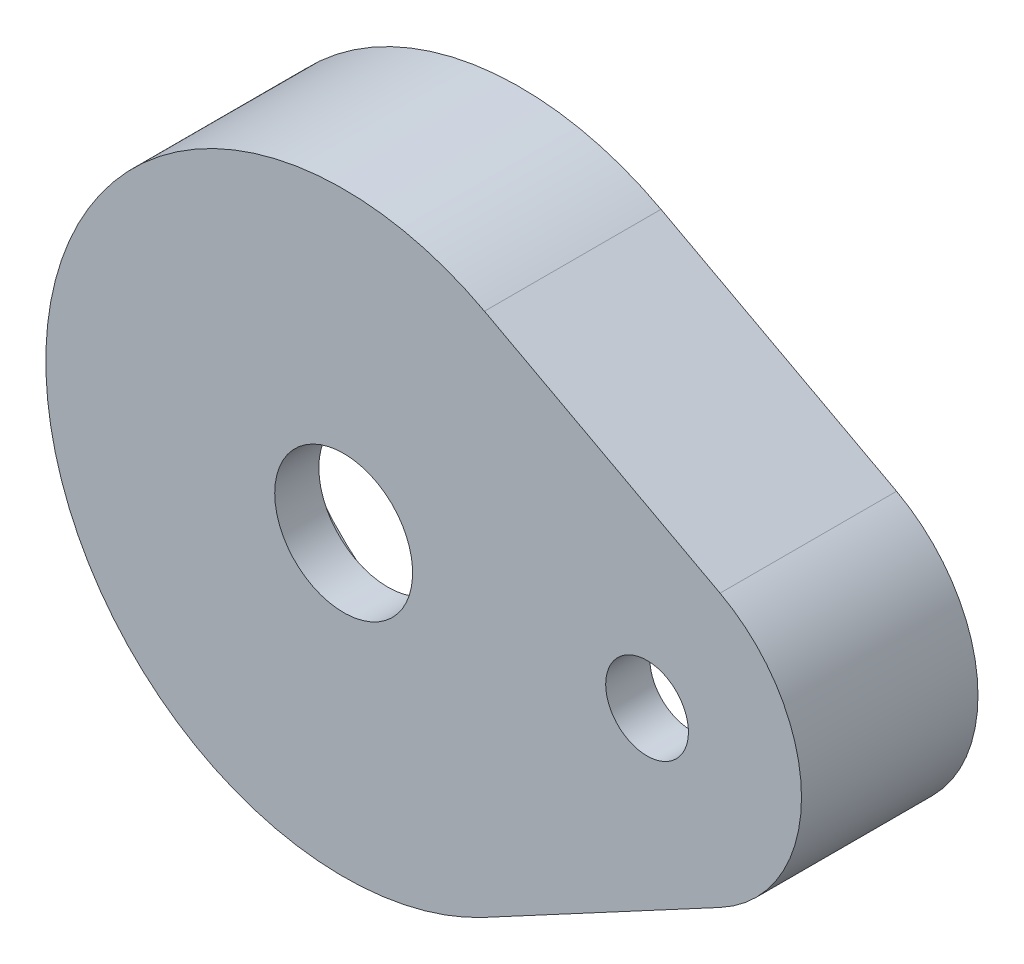
ISO-10303-21;
HEADER;
FILE_DESCRIPTION(('STEP AP214'),'2;1');
FILE_NAME('part.step','',(''),(''),'','','');
FILE_SCHEMA(('AUTOMOTIVE_DESIGN { 1 0 10303 214 1 1 1 1 }'));
ENDSEC;
DATA;
#1=APPLICATION_CONTEXT('core data for automotive mechanical design processes');
#2=APPLICATION_PROTOCOL_DEFINITION('international standard','automotive_design',2000,#1);
#3=PRODUCT_CONTEXT('',#1,'mechanical');
#4=PRODUCT('Part','Part','',(#3));
#5=PRODUCT_RELATED_PRODUCT_CATEGORY('part','',(#4));
#6=PRODUCT_DEFINITION_FORMATION('','',#4);
#7=PRODUCT_DEFINITION_CONTEXT('part definition',#1,'design');
#8=PRODUCT_DEFINITION('design','',#6,#7);
#9=PRODUCT_DEFINITION_SHAPE('','',#8);
#10=(LENGTH_UNIT() NAMED_UNIT(*) SI_UNIT(.MILLI.,.METRE.));
#11=(NAMED_UNIT(*) PLANE_ANGLE_UNIT() SI_UNIT($,.RADIAN.));
#12=(NAMED_UNIT(*) SI_UNIT($,.STERADIAN.) SOLID_ANGLE_UNIT());
#13=UNCERTAINTY_MEASURE_WITH_UNIT(LENGTH_MEASURE(1.E-05),#10,'distance_accuracy_value','');
#14=(GEOMETRIC_REPRESENTATION_CONTEXT(3) GLOBAL_UNCERTAINTY_ASSIGNED_CONTEXT((#13)) GLOBAL_UNIT_ASSIGNED_CONTEXT((#10,
#11,#12)) REPRESENTATION_CONTEXT('',''));
#15=CARTESIAN_POINT('',(0.,0.,0.));
#16=DIRECTION('',(0.,0.,1.));
#17=DIRECTION('',(1.,0.,0.));
#18=AXIS2_PLACEMENT_3D('',#15,#16,#17);
#19=CARTESIAN_POINT('',(0.,0.,0.));
#20=DIRECTION('',(0.,0.,1.));
#21=DIRECTION('',(1.,0.,0.));
#22=AXIS2_PLACEMENT_3D('',#19,#20,#21);
#23=PLANE('',#22);
#24=CARTESIAN_POINT('',(0.,0.,0.));
#25=DIRECTION('',(0.,0.,1.));
#26=DIRECTION('',(1.,0.,0.));
#27=AXIS2_PLACEMENT_3D('',#24,#25,#26);
#28=CIRCLE('',#27,17.145);
#29=CARTESIAN_POINT('',(8.1049090909091,15.1083246466343,0.));
#30=VERTEX_POINT('',#29);
#31=CARTESIAN_POINT('',(8.10490909090909,-15.1083246466344,0.));
#32=VERTEX_POINT('',#31);
#33=EDGE_CURVE('E133',#30,#32,#28,.T.);
#34=ORIENTED_EDGE('',*,*,#33,.F.);
#35=DIRECTION('',(-0.88120878662201,0.472727272727273,0.));
#36=VECTOR('',#35,1.);
#37=CARTESIAN_POINT('',(8.1049090909091,15.1083246466343,0.));
#38=LINE('',#37,#36);
#39=CARTESIAN_POINT('',(21.6650454545455,7.83394611306966,0.));
#40=VERTEX_POINT('',#39);
#41=EDGE_CURVE('E88',#40,#30,#38,.T.);
#42=ORIENTED_EDGE('',*,*,#41,.F.);
#43=CARTESIAN_POINT('',(17.4625,0.,0.));
#44=DIRECTION('',(0.,0.,1.));
#45=DIRECTION('',(1.,0.,0.));
#46=AXIS2_PLACEMENT_3D('',#43,#44,#45);
#47=CIRCLE('',#46,8.89);
#48=CARTESIAN_POINT('',(21.6650454545454,-7.83394611306966,0.));
#49=VERTEX_POINT('',#48);
#50=EDGE_CURVE('E153',#49,#40,#47,.T.);
#51=ORIENTED_EDGE('',*,*,#50,.F.);
#52=DIRECTION('',(0.88120878662201,0.472727272727273,0.));
#53=VECTOR('',#52,1.);
#54=CARTESIAN_POINT('',(8.10490909090909,-15.1083246466344,0.));
#55=LINE('',#54,#53);
#56=EDGE_CURVE('E138',#32,#49,#55,.T.);
#57=ORIENTED_EDGE('',*,*,#56,.F.);
#58=EDGE_LOOP('',(#34,#42,#51,#57));
#59=FACE_BOUND('',#58,.T.);
#60=CARTESIAN_POINT('',(0.,0.,0.));
#61=DIRECTION('',(0.,0.,1.));
#62=DIRECTION('',(1.,0.,0.));
#63=AXIS2_PLACEMENT_3D('',#60,#61,#62);
#64=CIRCLE('',#63,14.605);
#65=CARTESIAN_POINT('',(6.90418181818182,12.8700543286145,0.));
#66=VERTEX_POINT('',#65);
#67=CARTESIAN_POINT('',(6.90418181818182,-12.8700543286145,0.));
#68=VERTEX_POINT('',#67);
#69=EDGE_CURVE('E57',#66,#68,#64,.T.);
#70=ORIENTED_EDGE('',*,*,#69,.T.);
#71=DIRECTION('',(0.88120878662201,0.472727272727273,0.));
#72=VECTOR('',#71,1.);
#73=CARTESIAN_POINT('',(6.90418181818182,-12.8700543286145,0.));
#74=LINE('',#73,#72);
#75=CARTESIAN_POINT('',(20.4643181818182,-5.59567579504976,0.));
#76=VERTEX_POINT('',#75);
#77=EDGE_CURVE('E131',#68,#76,#74,.T.);
#78=ORIENTED_EDGE('',*,*,#77,.T.);
#79=CARTESIAN_POINT('',(17.4625,0.,0.));
#80=DIRECTION('',(0.,0.,1.));
#81=DIRECTION('',(1.,0.,0.));
#82=AXIS2_PLACEMENT_3D('',#79,#80,#81);
#83=CIRCLE('',#82,6.35);
#84=CARTESIAN_POINT('',(20.4643181818182,5.59567579504977,0.));
#85=VERTEX_POINT('',#84);
#86=EDGE_CURVE('E178',#76,#85,#83,.T.);
#87=ORIENTED_EDGE('',*,*,#86,.T.);
#88=DIRECTION('',(-0.88120878662201,0.472727272727273,0.));
#89=VECTOR('',#88,1.);
#90=CARTESIAN_POINT('',(6.90418181818182,12.8700543286145,0.));
#91=LINE('',#90,#89);
#92=EDGE_CURVE('E128',#85,#66,#91,.T.);
#93=ORIENTED_EDGE('',*,*,#92,.T.);
#94=EDGE_LOOP('',(#70,#78,#87,#93));
#95=FACE_BOUND('',#94,.T.);
#96=ADVANCED_FACE('F39',(#59,#95),#23,.F.);
#97=CARTESIAN_POINT('',(0.,0.,10.16));
#98=DIRECTION('',(0.,0.,-1.));
#99=DIRECTION('',(-1.,0.,0.));
#100=AXIS2_PLACEMENT_3D('',#97,#98,#99);
#101=CYLINDRICAL_SURFACE('',#100,17.145);
#102=ORIENTED_EDGE('',*,*,#33,.T.);
#103=DIRECTION('',(0.,0.,-1.));
#104=VECTOR('',#103,1.);
#105=CARTESIAN_POINT('',(8.10490909090909,-15.1083246466344,10.16));
#106=LINE('',#105,#104);
#107=CARTESIAN_POINT('',(8.10490909090909,-15.1083246466344,10.16));
#108=VERTEX_POINT('',#107);
#109=EDGE_CURVE('E11',#108,#32,#106,.T.);
#110=ORIENTED_EDGE('',*,*,#109,.F.);
#111=CARTESIAN_POINT('',(0.,0.,10.16));
#112=DIRECTION('',(0.,0.,1.));
#113=DIRECTION('',(1.,0.,0.));
#114=AXIS2_PLACEMENT_3D('',#111,#112,#113);
#115=CIRCLE('',#114,17.145);
#116=CARTESIAN_POINT('',(8.1049090909091,15.1083246466343,10.16));
#117=VERTEX_POINT('',#116);
#118=EDGE_CURVE('E144',#117,#108,#115,.T.);
#119=ORIENTED_EDGE('',*,*,#118,.F.);
#120=DIRECTION('',(0.,0.,-1.));
#121=VECTOR('',#120,1.);
#122=CARTESIAN_POINT('',(8.1049090909091,15.1083246466343,10.16));
#123=LINE('',#122,#121);
#124=EDGE_CURVE('E147',#117,#30,#123,.T.);
#125=ORIENTED_EDGE('',*,*,#124,.T.);
#126=EDGE_LOOP('',(#102,#110,#119,#125));
#127=FACE_BOUND('',#126,.T.);
#128=ADVANCED_FACE('F41',(#127),#101,.T.);
#129=CARTESIAN_POINT('',(8.10490909090909,-15.1083246466344,10.16));
#130=DIRECTION('',(-0.472727272727273,0.88120878662201,0.));
#131=DIRECTION('',(-0.88120878662201,-0.472727272727273,0.));
#132=AXIS2_PLACEMENT_3D('',#129,#130,#131);
#133=PLANE('',#132);
#134=ORIENTED_EDGE('',*,*,#56,.T.);
#135=DIRECTION('',(0.,0.,-1.));
#136=VECTOR('',#135,1.);
#137=CARTESIAN_POINT('',(21.6650454545454,-7.83394611306966,10.16));
#138=LINE('',#137,#136);
#139=CARTESIAN_POINT('',(21.6650454545454,-7.83394611306966,10.16));
#140=VERTEX_POINT('',#139);
#141=EDGE_CURVE('E48',#140,#49,#138,.T.);
#142=ORIENTED_EDGE('',*,*,#141,.F.);
#143=DIRECTION('',(0.88120878662201,0.472727272727273,0.));
#144=VECTOR('',#143,1.);
#145=CARTESIAN_POINT('',(8.10490909090909,-15.1083246466344,10.16));
#146=LINE('',#145,#144);
#147=EDGE_CURVE('E91',#108,#140,#146,.T.);
#148=ORIENTED_EDGE('',*,*,#147,.F.);
#149=ORIENTED_EDGE('',*,*,#109,.T.);
#150=EDGE_LOOP('',(#134,#142,#148,#149));
#151=FACE_BOUND('',#150,.T.);
#152=ADVANCED_FACE('F199',(#151),#133,.F.);
#153=CARTESIAN_POINT('',(17.4625,0.,10.16));
#154=DIRECTION('',(0.,0.,-1.));
#155=DIRECTION('',(-1.,0.,0.));
#156=AXIS2_PLACEMENT_3D('',#153,#154,#155);
#157=CYLINDRICAL_SURFACE('',#156,8.89);
#158=ORIENTED_EDGE('',*,*,#50,.T.);
#159=DIRECTION('',(0.,0.,-1.));
#160=VECTOR('',#159,1.);
#161=CARTESIAN_POINT('',(21.6650454545455,7.83394611306966,10.16));
#162=LINE('',#161,#160);
#163=CARTESIAN_POINT('',(21.6650454545455,7.83394611306966,10.16));
#164=VERTEX_POINT('',#163);
#165=EDGE_CURVE('E160',#164,#40,#162,.T.);
#166=ORIENTED_EDGE('',*,*,#165,.F.);
#167=CARTESIAN_POINT('',(17.4625,0.,10.16));
#168=DIRECTION('',(0.,0.,1.));
#169=DIRECTION('',(1.,0.,0.));
#170=AXIS2_PLACEMENT_3D('',#167,#168,#169);
#171=CIRCLE('',#170,8.89);
#172=EDGE_CURVE('E146',#140,#164,#171,.T.);
#173=ORIENTED_EDGE('',*,*,#172,.F.);
#174=ORIENTED_EDGE('',*,*,#141,.T.);
#175=EDGE_LOOP('',(#158,#166,#173,#174));
#176=FACE_BOUND('',#175,.T.);
#177=ADVANCED_FACE('F207',(#176),#157,.T.);
#178=CARTESIAN_POINT('',(8.1049090909091,15.1083246466343,10.16));
#179=DIRECTION('',(-0.472727272727273,-0.88120878662201,0.));
#180=DIRECTION('',(0.88120878662201,-0.472727272727273,0.));
#181=AXIS2_PLACEMENT_3D('',#178,#179,#180);
#182=PLANE('',#181);
#183=ORIENTED_EDGE('',*,*,#41,.T.);
#184=ORIENTED_EDGE('',*,*,#124,.F.);
#185=DIRECTION('',(-0.88120878662201,0.472727272727273,0.));
#186=VECTOR('',#185,1.);
#187=CARTESIAN_POINT('',(8.1049090909091,15.1083246466343,10.16));
#188=LINE('',#187,#186);
#189=EDGE_CURVE('E63',#164,#117,#188,.T.);
#190=ORIENTED_EDGE('',*,*,#189,.F.);
#191=ORIENTED_EDGE('',*,*,#165,.T.);
#192=EDGE_LOOP('',(#183,#184,#190,#191));
#193=FACE_BOUND('',#192,.T.);
#194=ADVANCED_FACE('F210',(#193),#182,.F.);
#195=CARTESIAN_POINT('',(0.,0.,10.16));
#196=DIRECTION('',(0.,0.,1.));
#197=DIRECTION('',(1.,0.,0.));
#198=AXIS2_PLACEMENT_3D('',#195,#196,#197);
#199=PLANE('',#198);
#200=CARTESIAN_POINT('',(0.,0.,10.16));
#201=DIRECTION('',(0.,0.,-1.));
#202=DIRECTION('',(-1.,0.,0.));
#203=AXIS2_PLACEMENT_3D('',#200,#201,#202);
#204=CIRCLE('',#203,3.96875);
#205=CARTESIAN_POINT('',(-3.96875,0.,10.16));
#206=VERTEX_POINT('',#205);
#207=EDGE_CURVE('E165',#206,#206,#204,.T.);
#208=ORIENTED_EDGE('',*,*,#207,.T.);
#209=EDGE_LOOP('',(#208));
#210=FACE_BOUND('',#209,.T.);
#211=CARTESIAN_POINT('',(17.4625,0.,10.16));
#212=DIRECTION('',(0.,0.,-1.));
#213=DIRECTION('',(-1.,0.,0.));
#214=AXIS2_PLACEMENT_3D('',#211,#212,#213);
#215=CIRCLE('',#214,2.38125);
#216=CARTESIAN_POINT('',(15.08125,0.,10.16));
#217=VERTEX_POINT('',#216);
#218=EDGE_CURVE('E170',#217,#217,#215,.T.);
#219=ORIENTED_EDGE('',*,*,#218,.T.);
#220=EDGE_LOOP('',(#219));
#221=FACE_BOUND('',#220,.T.);
#222=ORIENTED_EDGE('',*,*,#118,.T.);
#223=ORIENTED_EDGE('',*,*,#147,.T.);
#224=ORIENTED_EDGE('',*,*,#172,.T.);
#225=ORIENTED_EDGE('',*,*,#189,.T.);
#226=EDGE_LOOP('',(#222,#223,#224,#225));
#227=FACE_BOUND('',#226,.T.);
#228=ADVANCED_FACE('F202',(#210,#221,#227),#199,.T.);
#229=CARTESIAN_POINT('',(0.,0.,7.62));
#230=DIRECTION('',(0.,0.,-1.));
#231=DIRECTION('',(-1.,0.,0.));
#232=AXIS2_PLACEMENT_3D('',#229,#230,#231);
#233=CYLINDRICAL_SURFACE('',#232,14.605);
#234=ORIENTED_EDGE('',*,*,#69,.F.);
#235=DIRECTION('',(0.,0.,-1.));
#236=VECTOR('',#235,1.);
#237=CARTESIAN_POINT('',(6.90418181818182,12.8700543286145,7.62));
#238=LINE('',#237,#236);
#239=CARTESIAN_POINT('',(6.90418181818182,12.8700543286145,7.62));
#240=VERTEX_POINT('',#239);
#241=EDGE_CURVE('E129',#240,#66,#238,.T.);
#242=ORIENTED_EDGE('',*,*,#241,.F.);
#243=CARTESIAN_POINT('',(0.,0.,7.62));
#244=DIRECTION('',(0.,0.,1.));
#245=DIRECTION('',(1.,0.,0.));
#246=AXIS2_PLACEMENT_3D('',#243,#244,#245);
#247=CIRCLE('',#246,14.605);
#248=CARTESIAN_POINT('',(6.90418181818182,-12.8700543286145,7.62));
#249=VERTEX_POINT('',#248);
#250=EDGE_CURVE('E124',#240,#249,#247,.T.);
#251=ORIENTED_EDGE('',*,*,#250,.T.);
#252=DIRECTION('',(0.,0.,-1.));
#253=VECTOR('',#252,1.);
#254=CARTESIAN_POINT('',(6.90418181818182,-12.8700543286145,7.62));
#255=LINE('',#254,#253);
#256=EDGE_CURVE('E126',#249,#68,#255,.T.);
#257=ORIENTED_EDGE('',*,*,#256,.T.);
#258=EDGE_LOOP('',(#234,#242,#251,#257));
#259=FACE_BOUND('',#258,.T.);
#260=ADVANCED_FACE('F130',(#259),#233,.F.);
#261=CARTESIAN_POINT('',(6.90418181818182,-12.8700543286145,7.62));
#262=DIRECTION('',(-0.472727272727273,0.88120878662201,0.));
#263=DIRECTION('',(-0.88120878662201,-0.472727272727273,0.));
#264=AXIS2_PLACEMENT_3D('',#261,#262,#263);
#265=PLANE('',#264);
#266=ORIENTED_EDGE('',*,*,#77,.F.);
#267=ORIENTED_EDGE('',*,*,#256,.F.);
#268=DIRECTION('',(0.88120878662201,0.472727272727273,0.));
#269=VECTOR('',#268,1.);
#270=CARTESIAN_POINT('',(6.90418181818182,-12.8700543286145,7.62));
#271=LINE('',#270,#269);
#272=CARTESIAN_POINT('',(20.4643181818182,-5.59567579504976,7.62));
#273=VERTEX_POINT('',#272);
#274=EDGE_CURVE('E120',#249,#273,#271,.T.);
#275=ORIENTED_EDGE('',*,*,#274,.T.);
#276=DIRECTION('',(0.,0.,-1.));
#277=VECTOR('',#276,1.);
#278=CARTESIAN_POINT('',(20.4643181818182,-5.59567579504976,7.62));
#279=LINE('',#278,#277);
#280=EDGE_CURVE('E139',#273,#76,#279,.T.);
#281=ORIENTED_EDGE('',*,*,#280,.T.);
#282=EDGE_LOOP('',(#266,#267,#275,#281));
#283=FACE_BOUND('',#282,.T.);
#284=ADVANCED_FACE('F135',(#283),#265,.T.);
#285=CARTESIAN_POINT('',(17.4625,0.,7.62));
#286=DIRECTION('',(0.,0.,-1.));
#287=DIRECTION('',(-1.,0.,0.));
#288=AXIS2_PLACEMENT_3D('',#285,#286,#287);
#289=CYLINDRICAL_SURFACE('',#288,6.35);
#290=ORIENTED_EDGE('',*,*,#86,.F.);
#291=ORIENTED_EDGE('',*,*,#280,.F.);
#292=CARTESIAN_POINT('',(17.4625,0.,7.62));
#293=DIRECTION('',(0.,0.,1.));
#294=DIRECTION('',(1.,0.,0.));
#295=AXIS2_PLACEMENT_3D('',#292,#293,#294);
#296=CIRCLE('',#295,6.35);
#297=CARTESIAN_POINT('',(20.4643181818182,5.59567579504977,7.62));
#298=VERTEX_POINT('',#297);
#299=EDGE_CURVE('E121',#273,#298,#296,.T.);
#300=ORIENTED_EDGE('',*,*,#299,.T.);
#301=DIRECTION('',(0.,0.,-1.));
#302=VECTOR('',#301,1.);
#303=CARTESIAN_POINT('',(20.4643181818182,5.59567579504977,7.62));
#304=LINE('',#303,#302);
#305=EDGE_CURVE('E143',#298,#85,#304,.T.);
#306=ORIENTED_EDGE('',*,*,#305,.T.);
#307=EDGE_LOOP('',(#290,#291,#300,#306));
#308=FACE_BOUND('',#307,.T.);
#309=ADVANCED_FACE('F189',(#308),#289,.F.);
#310=CARTESIAN_POINT('',(6.90418181818182,12.8700543286145,7.62));
#311=DIRECTION('',(-0.472727272727273,-0.88120878662201,0.));
#312=DIRECTION('',(0.88120878662201,-0.472727272727273,0.));
#313=AXIS2_PLACEMENT_3D('',#310,#311,#312);
#314=PLANE('',#313);
#315=ORIENTED_EDGE('',*,*,#92,.F.);
#316=ORIENTED_EDGE('',*,*,#305,.F.);
#317=DIRECTION('',(-0.88120878662201,0.472727272727273,0.));
#318=VECTOR('',#317,1.);
#319=CARTESIAN_POINT('',(6.90418181818182,12.8700543286145,7.62));
#320=LINE('',#319,#318);
#321=EDGE_CURVE('E173',#298,#240,#320,.T.);
#322=ORIENTED_EDGE('',*,*,#321,.T.);
#323=ORIENTED_EDGE('',*,*,#241,.T.);
#324=EDGE_LOOP('',(#315,#316,#322,#323));
#325=FACE_BOUND('',#324,.T.);
#326=ADVANCED_FACE('F188',(#325),#314,.T.);
#327=CARTESIAN_POINT('',(0.,0.,7.62));
#328=DIRECTION('',(0.,0.,1.));
#329=DIRECTION('',(1.,0.,0.));
#330=AXIS2_PLACEMENT_3D('',#327,#328,#329);
#331=PLANE('',#330);
#332=CARTESIAN_POINT('',(0.,0.,7.62));
#333=DIRECTION('',(0.,0.,1.));
#334=DIRECTION('',(1.,0.,0.));
#335=AXIS2_PLACEMENT_3D('',#332,#333,#334);
#336=CIRCLE('',#335,3.96875);
#337=CARTESIAN_POINT('',(3.96875,0.,7.62));
#338=VERTEX_POINT('',#337);
#339=EDGE_CURVE('E43',#338,#338,#336,.T.);
#340=ORIENTED_EDGE('',*,*,#339,.T.);
#341=EDGE_LOOP('',(#340));
#342=FACE_BOUND('',#341,.T.);
#343=CARTESIAN_POINT('',(17.4625,0.,7.62));
#344=DIRECTION('',(0.,0.,1.));
#345=DIRECTION('',(1.,0.,0.));
#346=AXIS2_PLACEMENT_3D('',#343,#344,#345);
#347=CIRCLE('',#346,2.38125);
#348=CARTESIAN_POINT('',(19.84375,0.,7.62));
#349=VERTEX_POINT('',#348);
#350=EDGE_CURVE('E159',#349,#349,#347,.T.);
#351=ORIENTED_EDGE('',*,*,#350,.T.);
#352=EDGE_LOOP('',(#351));
#353=FACE_BOUND('',#352,.T.);
#354=ORIENTED_EDGE('',*,*,#250,.F.);
#355=ORIENTED_EDGE('',*,*,#321,.F.);
#356=ORIENTED_EDGE('',*,*,#299,.F.);
#357=ORIENTED_EDGE('',*,*,#274,.F.);
#358=EDGE_LOOP('',(#354,#355,#356,#357));
#359=FACE_BOUND('',#358,.T.);
#360=ADVANCED_FACE('F116',(#342,#353,#359),#331,.F.);
#361=CARTESIAN_POINT('',(17.4625,0.,10.16));
#362=DIRECTION('',(0.,0.,-1.));
#363=DIRECTION('',(-1.,0.,0.));
#364=AXIS2_PLACEMENT_3D('',#361,#362,#363);
#365=CYLINDRICAL_SURFACE('',#364,2.38125);
#366=ORIENTED_EDGE('',*,*,#218,.F.);
#367=EDGE_LOOP('',(#366));
#368=FACE_BOUND('',#367,.T.);
#369=ORIENTED_EDGE('',*,*,#350,.F.);
#370=EDGE_LOOP('',(#369));
#371=FACE_BOUND('',#370,.T.);
#372=ADVANCED_FACE('F229',(#368,#371),#365,.F.);
#373=CARTESIAN_POINT('',(0.,0.,10.16));
#374=DIRECTION('',(0.,0.,-1.));
#375=DIRECTION('',(-1.,0.,0.));
#376=AXIS2_PLACEMENT_3D('',#373,#374,#375);
#377=CYLINDRICAL_SURFACE('',#376,3.96875);
#378=ORIENTED_EDGE('',*,*,#207,.F.);
#379=EDGE_LOOP('',(#378));
#380=FACE_BOUND('',#379,.T.);
#381=ORIENTED_EDGE('',*,*,#339,.F.);
#382=EDGE_LOOP('',(#381));
#383=FACE_BOUND('',#382,.T.);
#384=ADVANCED_FACE('F234',(#380,#383),#377,.F.);
#385=CLOSED_SHELL('',(#96,#128,#152,#177,#194,#228,#260,#284,#309,#326,#360,#372,#384));
#386=MANIFOLD_SOLID_BREP('B2',#385);
#387=ADVANCED_BREP_SHAPE_REPRESENTATION('',(#18,#386),#14);
#388=SHAPE_DEFINITION_REPRESENTATION(#9,#387);
ENDSEC;
END-ISO-10303-21;
